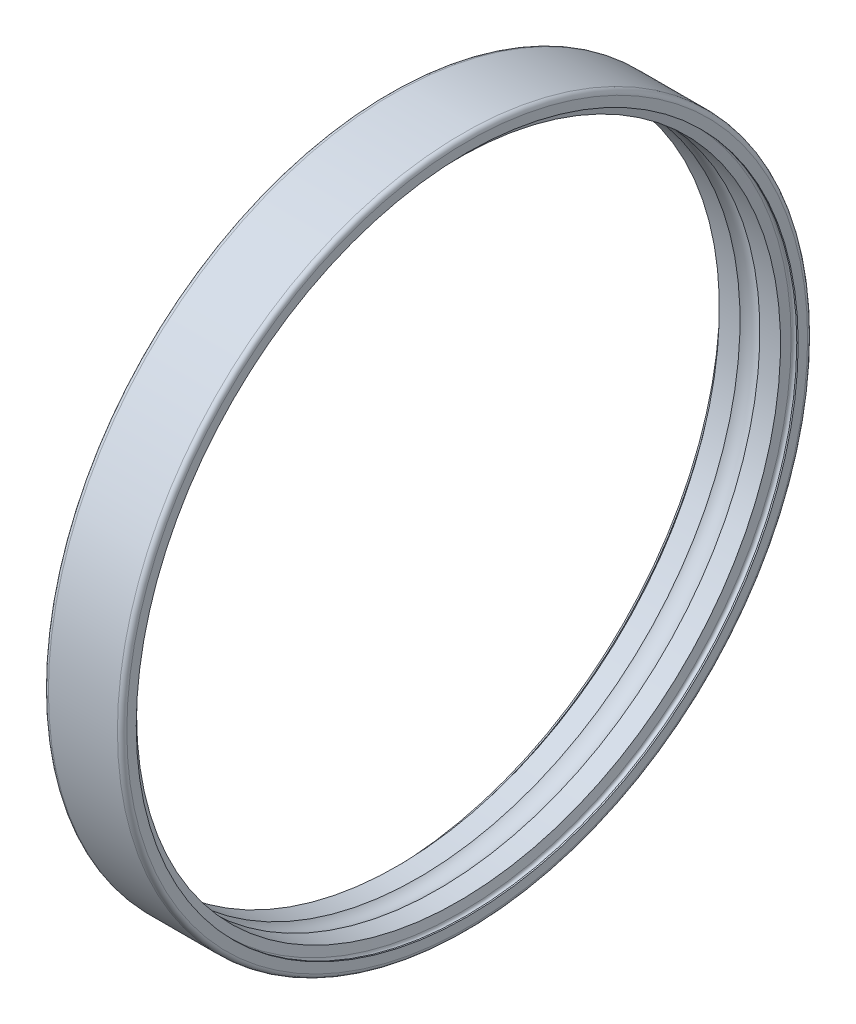
ISO-10303-21;
HEADER;
FILE_DESCRIPTION(('STEP AP214'),'2;1');
FILE_NAME('part.step','',(''),(''),'','','');
FILE_SCHEMA(('AUTOMOTIVE_DESIGN { 1 0 10303 214 1 1 1 1 }'));
ENDSEC;
DATA;
#1=APPLICATION_CONTEXT('core data for automotive mechanical design processes');
#2=APPLICATION_PROTOCOL_DEFINITION('international standard','automotive_design',2000,#1);
#3=PRODUCT_CONTEXT('',#1,'mechanical');
#4=PRODUCT('Part','Part','',(#3));
#5=PRODUCT_RELATED_PRODUCT_CATEGORY('part','',(#4));
#6=PRODUCT_DEFINITION_FORMATION('','',#4);
#7=PRODUCT_DEFINITION_CONTEXT('part definition',#1,'design');
#8=PRODUCT_DEFINITION('design','',#6,#7);
#9=PRODUCT_DEFINITION_SHAPE('','',#8);
#10=(LENGTH_UNIT() NAMED_UNIT(*) SI_UNIT(.MILLI.,.METRE.));
#11=(NAMED_UNIT(*) PLANE_ANGLE_UNIT() SI_UNIT($,.RADIAN.));
#12=(NAMED_UNIT(*) SI_UNIT($,.STERADIAN.) SOLID_ANGLE_UNIT());
#13=UNCERTAINTY_MEASURE_WITH_UNIT(LENGTH_MEASURE(1.E-05),#10,'distance_accuracy_value','');
#14=(GEOMETRIC_REPRESENTATION_CONTEXT(3) GLOBAL_UNCERTAINTY_ASSIGNED_CONTEXT((#13)) GLOBAL_UNIT_ASSIGNED_CONTEXT((#10,
#11,#12)) REPRESENTATION_CONTEXT('',''));
#15=CARTESIAN_POINT('',(0.,0.,0.));
#16=DIRECTION('',(0.,0.,1.));
#17=DIRECTION('',(1.,0.,0.));
#18=AXIS2_PLACEMENT_3D('',#15,#16,#17);
#19=CARTESIAN_POINT('',(0.,-22.1031066592185,-21.7));
#20=DIRECTION('',(-1.,0.,0.));
#21=DIRECTION('',(0.,0.,1.));
#22=AXIS2_PLACEMENT_3D('',#19,#20,#21);
#23=PLANE('',#22);
#24=CARTESIAN_POINT('',(0.,0.,0.));
#25=DIRECTION('',(-1.,0.,0.));
#26=DIRECTION('',(0.,0.,-1.));
#27=AXIS2_PLACEMENT_3D('',#24,#25,#26);
#28=CIRCLE('',#27,21.7);
#29=CARTESIAN_POINT('',(0.,0.,-21.7));
#30=VERTEX_POINT('',#29);
#31=EDGE_CURVE('E62',#30,#30,#28,.F.);
#32=ORIENTED_EDGE('',*,*,#31,.F.);
#33=EDGE_LOOP('',(#32));
#34=FACE_BOUND('',#33,.T.);
#35=CARTESIAN_POINT('',(0.,0.,0.));
#36=DIRECTION('',(1.,0.,0.));
#37=DIRECTION('',(0.,0.,1.));
#38=AXIS2_PLACEMENT_3D('',#35,#36,#37);
#39=CIRCLE('',#38,21.1);
#40=CARTESIAN_POINT('',(0.,0.,21.1));
#41=VERTEX_POINT('',#40);
#42=EDGE_CURVE('E59',#41,#41,#39,.T.);
#43=ORIENTED_EDGE('',*,*,#42,.T.);
#44=EDGE_LOOP('',(#43));
#45=FACE_BOUND('',#44,.T.);
#46=ADVANCED_FACE('F15',(#34,#45),#23,.T.);
#47=CARTESIAN_POINT('',(5.,-22.1031066592185,21.7));
#48=DIRECTION('',(1.,0.,0.));
#49=DIRECTION('',(0.,0.,-1.));
#50=AXIS2_PLACEMENT_3D('',#47,#48,#49);
#51=PLANE('',#50);
#52=CARTESIAN_POINT('',(5.,0.,0.));
#53=DIRECTION('',(1.,0.,0.));
#54=DIRECTION('',(0.,0.,1.));
#55=AXIS2_PLACEMENT_3D('',#52,#53,#54);
#56=CIRCLE('',#55,21.7);
#57=CARTESIAN_POINT('',(5.,0.,21.7));
#58=VERTEX_POINT('',#57);
#59=EDGE_CURVE('E56',#58,#58,#56,.T.);
#60=ORIENTED_EDGE('',*,*,#59,.T.);
#61=EDGE_LOOP('',(#60));
#62=FACE_BOUND('',#61,.T.);
#63=CARTESIAN_POINT('',(5.,0.,0.));
#64=DIRECTION('',(-1.,0.,0.));
#65=DIRECTION('',(0.,0.,-1.));
#66=AXIS2_PLACEMENT_3D('',#63,#64,#65);
#67=CIRCLE('',#66,21.1);
#68=CARTESIAN_POINT('',(5.,0.,-21.1));
#69=VERTEX_POINT('',#68);
#70=EDGE_CURVE('E53',#69,#69,#67,.F.);
#71=ORIENTED_EDGE('',*,*,#70,.F.);
#72=EDGE_LOOP('',(#71));
#73=FACE_BOUND('',#72,.T.);
#74=ADVANCED_FACE('F70',(#62,#73),#51,.T.);
#75=CARTESIAN_POINT('',(50.,0.,0.));
#76=DIRECTION('',(1.,0.,0.));
#77=DIRECTION('',(0.,0.,1.));
#78=AXIS2_PLACEMENT_3D('',#75,#76,#77);
#79=CYLINDRICAL_SURFACE('',#78,21.1);
#80=CARTESIAN_POINT('',(0.0900000000000034,0.,0.));
#81=DIRECTION('',(1.,0.,0.));
#82=DIRECTION('',(0.,0.,1.));
#83=AXIS2_PLACEMENT_3D('',#80,#81,#82);
#84=CIRCLE('',#83,21.1);
#85=CARTESIAN_POINT('',(0.0900000000000034,0.,21.1));
#86=VERTEX_POINT('',#85);
#87=EDGE_CURVE('E50',#86,#86,#84,.T.);
#88=ORIENTED_EDGE('',*,*,#87,.T.);
#89=EDGE_LOOP('',(#88));
#90=FACE_BOUND('',#89,.T.);
#91=ORIENTED_EDGE('',*,*,#42,.F.);
#92=EDGE_LOOP('',(#91));
#93=FACE_BOUND('',#92,.T.);
#94=ADVANCED_FACE('F74',(#90,#93),#79,.F.);
#95=CARTESIAN_POINT('',(0.27,0.,0.));
#96=DIRECTION('',(1.,0.,0.));
#97=DIRECTION('',(0.,0.,1.));
#98=AXIS2_PLACEMENT_3D('',#95,#96,#97);
#99=TOROIDAL_SURFACE('',#98,21.1,0.18);
#100=ORIENTED_EDGE('',*,*,#87,.F.);
#101=EDGE_LOOP('',(#100));
#102=FACE_BOUND('',#101,.T.);
#103=CARTESIAN_POINT('',(0.45,0.,0.));
#104=DIRECTION('',(1.,0.,0.));
#105=DIRECTION('',(0.,-1.92327808894025E-10,1.));
#106=AXIS2_PLACEMENT_3D('',#103,#104,#105);
#107=CIRCLE('',#106,21.1);
#108=CARTESIAN_POINT('',(0.45,-4.05811676766392E-09,21.1));
#109=VERTEX_POINT('',#108);
#110=EDGE_CURVE('E47',#109,#109,#107,.T.);
#111=ORIENTED_EDGE('',*,*,#110,.T.);
#112=EDGE_LOOP('',(#111));
#113=FACE_BOUND('',#112,.T.);
#114=ADVANCED_FACE('F76',(#102,#113),#99,.F.);
#115=CARTESIAN_POINT('',(0.449999999999998,0.,0.));
#116=DIRECTION('',(-1.,0.,0.));
#117=DIRECTION('',(0.,0.,-1.));
#118=AXIS2_PLACEMENT_3D('',#115,#116,#117);
#119=CONICAL_SURFACE('',#118,21.1,1.39626340159546);
#120=ORIENTED_EDGE('',*,*,#110,.F.);
#121=EDGE_LOOP('',(#120));
#122=FACE_BOUND('',#121,.T.);
#123=CARTESIAN_POINT('',(0.551388013907368,0.,0.));
#124=DIRECTION('',(1.,0.,0.));
#125=DIRECTION('',(0.,0.,1.));
#126=AXIS2_PLACEMENT_3D('',#123,#124,#125);
#127=CIRCLE('',#126,20.525);
#128=CARTESIAN_POINT('',(0.551388013907368,0.,20.525));
#129=VERTEX_POINT('',#128);
#130=EDGE_CURVE('E44',#129,#129,#127,.T.);
#131=ORIENTED_EDGE('',*,*,#130,.T.);
#132=EDGE_LOOP('',(#131));
#133=FACE_BOUND('',#132,.T.);
#134=ADVANCED_FACE('F84',(#122,#133),#119,.F.);
#135=CARTESIAN_POINT('',(50.,0.,0.));
#136=DIRECTION('',(1.,0.,0.));
#137=DIRECTION('',(0.,0.,1.));
#138=AXIS2_PLACEMENT_3D('',#135,#136,#137);
#139=CYLINDRICAL_SURFACE('',#138,20.525);
#140=CARTESIAN_POINT('',(1.8680387670118,0.,0.));
#141=DIRECTION('',(1.,0.,0.));
#142=DIRECTION('',(0.,0.,1.));
#143=AXIS2_PLACEMENT_3D('',#140,#141,#142);
#144=CIRCLE('',#143,20.525);
#145=CARTESIAN_POINT('',(1.8680387670118,0.,20.525));
#146=VERTEX_POINT('',#145);
#147=EDGE_CURVE('E41',#146,#146,#144,.T.);
#148=ORIENTED_EDGE('',*,*,#147,.T.);
#149=EDGE_LOOP('',(#148));
#150=FACE_BOUND('',#149,.T.);
#151=ORIENTED_EDGE('',*,*,#130,.F.);
#152=EDGE_LOOP('',(#151));
#153=FACE_BOUND('',#152,.T.);
#154=ADVANCED_FACE('F92',(#150,#153),#139,.F.);
#155=CARTESIAN_POINT('',(2.5,0.,0.));
#156=DIRECTION('',(1.,0.,0.));
#157=DIRECTION('',(0.,0.,1.));
#158=AXIS2_PLACEMENT_3D('',#155,#156,#157);
#159=TOROIDAL_SURFACE('',#158,19.75,0.999999999999911);
#160=ORIENTED_EDGE('',*,*,#147,.F.);
#161=EDGE_LOOP('',(#160));
#162=FACE_BOUND('',#161,.T.);
#163=CARTESIAN_POINT('',(3.13196123298815,0.,0.));
#164=DIRECTION('',(1.,0.,0.));
#165=DIRECTION('',(0.,-1.92335580455197E-10,1.));
#166=AXIS2_PLACEMENT_3D('',#163,#164,#165);
#167=CIRCLE('',#166,20.525);
#168=CARTESIAN_POINT('',(3.13196123298815,-3.94768778884291E-09,20.525));
#169=VERTEX_POINT('',#168);
#170=EDGE_CURVE('E38',#169,#169,#167,.T.);
#171=ORIENTED_EDGE('',*,*,#170,.T.);
#172=EDGE_LOOP('',(#171));
#173=FACE_BOUND('',#172,.T.);
#174=ADVANCED_FACE('F96',(#162,#173),#159,.F.);
#175=CARTESIAN_POINT('',(50.,0.,0.));
#176=DIRECTION('',(1.,0.,0.));
#177=DIRECTION('',(0.,0.,1.));
#178=AXIS2_PLACEMENT_3D('',#175,#176,#177);
#179=CYLINDRICAL_SURFACE('',#178,20.525);
#180=CARTESIAN_POINT('',(4.4486119860926,0.,0.));
#181=DIRECTION('',(1.,0.,0.));
#182=DIRECTION('',(0.,0.,1.));
#183=AXIS2_PLACEMENT_3D('',#180,#181,#182);
#184=CIRCLE('',#183,20.525);
#185=CARTESIAN_POINT('',(4.4486119860926,0.,20.525));
#186=VERTEX_POINT('',#185);
#187=EDGE_CURVE('E35',#186,#186,#184,.T.);
#188=ORIENTED_EDGE('',*,*,#187,.T.);
#189=EDGE_LOOP('',(#188));
#190=FACE_BOUND('',#189,.T.);
#191=ORIENTED_EDGE('',*,*,#170,.F.);
#192=EDGE_LOOP('',(#191));
#193=FACE_BOUND('',#192,.T.);
#194=ADVANCED_FACE('F100',(#190,#193),#179,.F.);
#195=CARTESIAN_POINT('',(4.55,0.,0.));
#196=DIRECTION('',(1.,0.,0.));
#197=DIRECTION('',(0.,0.,1.));
#198=AXIS2_PLACEMENT_3D('',#195,#196,#197);
#199=CONICAL_SURFACE('',#198,21.1,1.39626340159541);
#200=CARTESIAN_POINT('',(4.55,0.,0.));
#201=DIRECTION('',(1.,0.,0.));
#202=DIRECTION('',(0.,0.,1.));
#203=AXIS2_PLACEMENT_3D('',#200,#201,#202);
#204=CIRCLE('',#203,21.1);
#205=CARTESIAN_POINT('',(4.55,0.,21.1));
#206=VERTEX_POINT('',#205);
#207=EDGE_CURVE('E30',#206,#206,#204,.T.);
#208=ORIENTED_EDGE('',*,*,#207,.T.);
#209=EDGE_LOOP('',(#208));
#210=FACE_BOUND('',#209,.T.);
#211=ORIENTED_EDGE('',*,*,#187,.F.);
#212=EDGE_LOOP('',(#211));
#213=FACE_BOUND('',#212,.T.);
#214=ADVANCED_FACE('F104',(#210,#213),#199,.F.);
#215=CARTESIAN_POINT('',(4.73,0.,0.));
#216=DIRECTION('',(1.,0.,0.));
#217=DIRECTION('',(0.,7.69373132210457E-10,1.));
#218=AXIS2_PLACEMENT_3D('',#215,#216,#217);
#219=TOROIDAL_SURFACE('',#218,21.1,0.18);
#220=ORIENTED_EDGE('',*,*,#207,.F.);
#221=EDGE_LOOP('',(#220));
#222=FACE_BOUND('',#221,.T.);
#223=CARTESIAN_POINT('',(4.91,0.,0.));
#224=DIRECTION('',(1.,0.,0.));
#225=DIRECTION('',(0.,0.,1.));
#226=AXIS2_PLACEMENT_3D('',#223,#224,#225);
#227=CIRCLE('',#226,21.1);
#228=CARTESIAN_POINT('',(4.91,0.,21.1));
#229=VERTEX_POINT('',#228);
#230=EDGE_CURVE('E26',#229,#229,#227,.T.);
#231=ORIENTED_EDGE('',*,*,#230,.T.);
#232=EDGE_LOOP('',(#231));
#233=FACE_BOUND('',#232,.T.);
#234=ADVANCED_FACE('F108',(#222,#233),#219,.F.);
#235=CARTESIAN_POINT('',(50.,0.,0.));
#236=DIRECTION('',(1.,0.,0.));
#237=DIRECTION('',(0.,1.1685524884468E-09,1.));
#238=AXIS2_PLACEMENT_3D('',#235,#236,#237);
#239=CYLINDRICAL_SURFACE('',#238,21.1);
#240=ORIENTED_EDGE('',*,*,#70,.T.);
#241=EDGE_LOOP('',(#240));
#242=FACE_BOUND('',#241,.T.);
#243=ORIENTED_EDGE('',*,*,#230,.F.);
#244=EDGE_LOOP('',(#243));
#245=FACE_BOUND('',#244,.T.);
#246=ADVANCED_FACE('F112',(#242,#245),#239,.F.);
#247=CARTESIAN_POINT('',(4.70000000000012,0.,0.));
#248=DIRECTION('',(1.,0.,0.));
#249=DIRECTION('',(0.,0.,1.));
#250=AXIS2_PLACEMENT_3D('',#247,#248,#249);
#251=TOROIDAL_SURFACE('',#250,21.7,0.299999999999878);
#252=CARTESIAN_POINT('',(4.70000000000012,0.,0.));
#253=DIRECTION('',(1.,0.,0.));
#254=DIRECTION('',(0.,0.,1.));
#255=AXIS2_PLACEMENT_3D('',#252,#253,#254);
#256=CIRCLE('',#255,21.9999999999999);
#257=CARTESIAN_POINT('',(4.70000000000012,0.,21.9999999999999));
#258=VERTEX_POINT('',#257);
#259=EDGE_CURVE('E22',#258,#258,#256,.T.);
#260=ORIENTED_EDGE('',*,*,#259,.T.);
#261=EDGE_LOOP('',(#260));
#262=FACE_BOUND('',#261,.T.);
#263=ORIENTED_EDGE('',*,*,#59,.F.);
#264=EDGE_LOOP('',(#263));
#265=FACE_BOUND('',#264,.T.);
#266=ADVANCED_FACE('F116',(#262,#265),#251,.T.);
#267=CARTESIAN_POINT('',(50.,0.,0.));
#268=DIRECTION('',(1.,0.,0.));
#269=DIRECTION('',(0.,0.,1.));
#270=AXIS2_PLACEMENT_3D('',#267,#268,#269);
#271=CYLINDRICAL_SURFACE('',#270,22.);
#272=CARTESIAN_POINT('',(0.299999999999969,0.,0.));
#273=DIRECTION('',(1.,0.,0.));
#274=DIRECTION('',(0.,0.,1.));
#275=AXIS2_PLACEMENT_3D('',#272,#273,#274);
#276=CIRCLE('',#275,22.);
#277=CARTESIAN_POINT('',(0.299999999999969,0.,22.));
#278=VERTEX_POINT('',#277);
#279=EDGE_CURVE('E10',#278,#278,#276,.T.);
#280=ORIENTED_EDGE('',*,*,#279,.T.);
#281=EDGE_LOOP('',(#280));
#282=FACE_BOUND('',#281,.T.);
#283=ORIENTED_EDGE('',*,*,#259,.F.);
#284=EDGE_LOOP('',(#283));
#285=FACE_BOUND('',#284,.T.);
#286=ADVANCED_FACE('F119',(#282,#285),#271,.T.);
#287=CARTESIAN_POINT('',(0.29999999999994,0.,0.));
#288=DIRECTION('',(1.,0.,0.));
#289=DIRECTION('',(0.,0.,1.));
#290=AXIS2_PLACEMENT_3D('',#287,#288,#289);
#291=TOROIDAL_SURFACE('',#290,21.7,0.299999999999939);
#292=ORIENTED_EDGE('',*,*,#31,.T.);
#293=EDGE_LOOP('',(#292));
#294=FACE_BOUND('',#293,.T.);
#295=ORIENTED_EDGE('',*,*,#279,.F.);
#296=EDGE_LOOP('',(#295));
#297=FACE_BOUND('',#296,.T.);
#298=ADVANCED_FACE('F17',(#294,#297),#291,.T.);
#299=CLOSED_SHELL('',(#46,#74,#94,#114,#134,#154,#174,#194,#214,#234,#246,#266,#286,#298));
#300=MANIFOLD_SOLID_BREP('B1',#299);
#301=ADVANCED_BREP_SHAPE_REPRESENTATION('',(#18,#300),#14);
#302=SHAPE_DEFINITION_REPRESENTATION(#9,#301);
ENDSEC;
END-ISO-10303-21;
